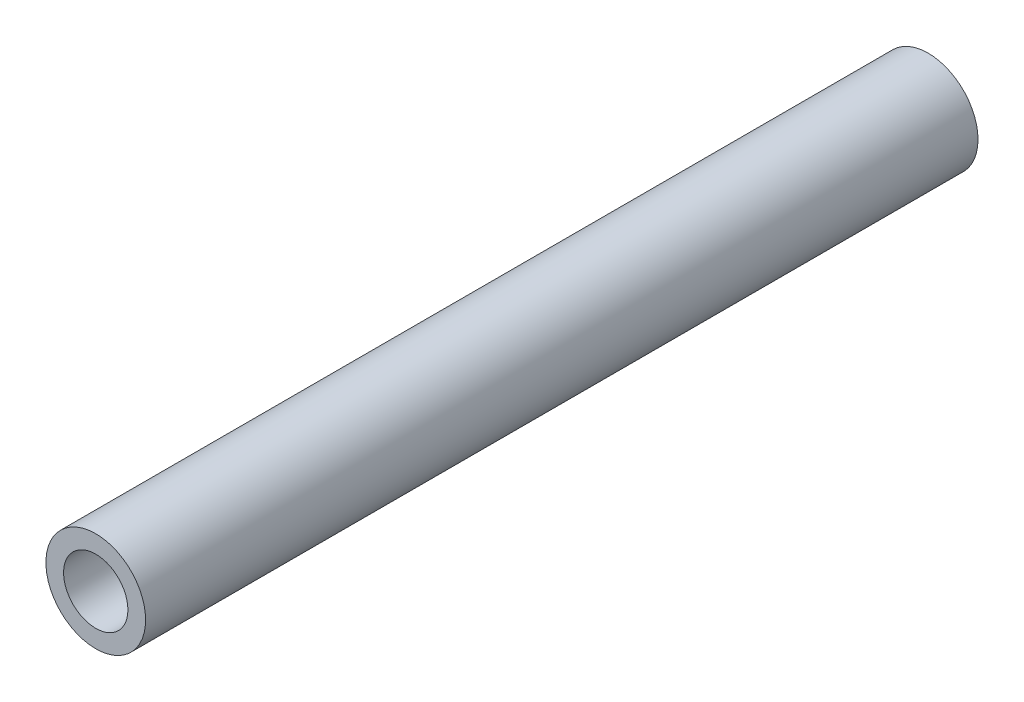
ISO-10303-21;
HEADER;
FILE_DESCRIPTION(('STEP AP214'),'2;1');
FILE_NAME('part.step','',(''),(''),'','','');
FILE_SCHEMA(('AUTOMOTIVE_DESIGN { 1 0 10303 214 1 1 1 1 }'));
ENDSEC;
DATA;
#1=APPLICATION_CONTEXT('core data for automotive mechanical design processes');
#2=APPLICATION_PROTOCOL_DEFINITION('international standard','automotive_design',2000,#1);
#3=PRODUCT_CONTEXT('',#1,'mechanical');
#4=PRODUCT('Part','Part','',(#3));
#5=PRODUCT_RELATED_PRODUCT_CATEGORY('part','',(#4));
#6=PRODUCT_DEFINITION_FORMATION('','',#4);
#7=PRODUCT_DEFINITION_CONTEXT('part definition',#1,'design');
#8=PRODUCT_DEFINITION('design','',#6,#7);
#9=PRODUCT_DEFINITION_SHAPE('','',#8);
#10=(LENGTH_UNIT() NAMED_UNIT(*) SI_UNIT(.MILLI.,.METRE.));
#11=(NAMED_UNIT(*) PLANE_ANGLE_UNIT() SI_UNIT($,.RADIAN.));
#12=(NAMED_UNIT(*) SI_UNIT($,.STERADIAN.) SOLID_ANGLE_UNIT());
#13=UNCERTAINTY_MEASURE_WITH_UNIT(LENGTH_MEASURE(1.E-05),#10,'distance_accuracy_value','');
#14=(GEOMETRIC_REPRESENTATION_CONTEXT(3) GLOBAL_UNCERTAINTY_ASSIGNED_CONTEXT((#13)) GLOBAL_UNIT_ASSIGNED_CONTEXT((#10,
#11,#12)) REPRESENTATION_CONTEXT('',''));
#15=CARTESIAN_POINT('',(0.,0.,0.));
#16=DIRECTION('',(0.,0.,1.));
#17=DIRECTION('',(1.,0.,0.));
#18=AXIS2_PLACEMENT_3D('',#15,#16,#17);
#19=CARTESIAN_POINT('',(0.,0.,66.802));
#20=DIRECTION('',(0.,0.,1.));
#21=DIRECTION('',(1.,0.,0.));
#22=AXIS2_PLACEMENT_3D('',#19,#20,#21);
#23=PLANE('',#22);
#24=CARTESIAN_POINT('',(0.,0.,66.802));
#25=DIRECTION('',(0.,0.,1.));
#26=DIRECTION('',(1.,0.,0.));
#27=AXIS2_PLACEMENT_3D('',#24,#25,#26);
#28=CIRCLE('',#27,4.);
#29=CARTESIAN_POINT('',(4.,0.,66.802));
#30=VERTEX_POINT('',#29);
#31=EDGE_CURVE('E10',#30,#30,#28,.T.);
#32=ORIENTED_EDGE('',*,*,#31,.T.);
#33=EDGE_LOOP('',(#32));
#34=FACE_BOUND('',#33,.T.);
#35=CARTESIAN_POINT('',(0.,0.,66.802));
#36=DIRECTION('',(0.,0.,1.));
#37=DIRECTION('',(1.,0.,0.));
#38=AXIS2_PLACEMENT_3D('',#35,#36,#37);
#39=CIRCLE('',#38,2.58037788044396);
#40=CARTESIAN_POINT('',(2.58037788044396,0.,66.802));
#41=VERTEX_POINT('',#40);
#42=EDGE_CURVE('E43',#41,#41,#39,.T.);
#43=ORIENTED_EDGE('',*,*,#42,.F.);
#44=EDGE_LOOP('',(#43));
#45=FACE_BOUND('',#44,.T.);
#46=ADVANCED_FACE('F32',(#34,#45),#23,.T.);
#47=CARTESIAN_POINT('',(0.,0.,0.));
#48=DIRECTION('',(0.,0.,1.));
#49=DIRECTION('',(1.,0.,0.));
#50=AXIS2_PLACEMENT_3D('',#47,#48,#49);
#51=PLANE('',#50);
#52=CARTESIAN_POINT('',(0.,0.,0.));
#53=DIRECTION('',(0.,0.,1.));
#54=DIRECTION('',(1.,0.,0.));
#55=AXIS2_PLACEMENT_3D('',#52,#53,#54);
#56=CIRCLE('',#55,4.);
#57=CARTESIAN_POINT('',(4.,0.,0.));
#58=VERTEX_POINT('',#57);
#59=EDGE_CURVE('E36',#58,#58,#56,.T.);
#60=ORIENTED_EDGE('',*,*,#59,.F.);
#61=EDGE_LOOP('',(#60));
#62=FACE_BOUND('',#61,.T.);
#63=CARTESIAN_POINT('',(0.,0.,0.));
#64=DIRECTION('',(0.,0.,1.));
#65=DIRECTION('',(1.,0.,0.));
#66=AXIS2_PLACEMENT_3D('',#63,#64,#65);
#67=CIRCLE('',#66,2.58037788044396);
#68=CARTESIAN_POINT('',(2.58037788044396,0.,0.));
#69=VERTEX_POINT('',#68);
#70=EDGE_CURVE('E45',#69,#69,#67,.T.);
#71=ORIENTED_EDGE('',*,*,#70,.T.);
#72=EDGE_LOOP('',(#71));
#73=FACE_BOUND('',#72,.T.);
#74=ADVANCED_FACE('F55',(#62,#73),#51,.F.);
#75=CARTESIAN_POINT('',(0.,0.,66.802));
#76=DIRECTION('',(0.,0.,-1.));
#77=DIRECTION('',(-1.,0.,0.));
#78=AXIS2_PLACEMENT_3D('',#75,#76,#77);
#79=CYLINDRICAL_SURFACE('',#78,4.);
#80=ORIENTED_EDGE('',*,*,#31,.F.);
#81=EDGE_LOOP('',(#80));
#82=FACE_BOUND('',#81,.T.);
#83=ORIENTED_EDGE('',*,*,#59,.T.);
#84=EDGE_LOOP('',(#83));
#85=FACE_BOUND('',#84,.T.);
#86=ADVANCED_FACE('F34',(#82,#85),#79,.T.);
#87=CARTESIAN_POINT('',(0.,0.,66.802));
#88=DIRECTION('',(0.,0.,-1.));
#89=DIRECTION('',(-1.,0.,0.));
#90=AXIS2_PLACEMENT_3D('',#87,#88,#89);
#91=CYLINDRICAL_SURFACE('',#90,2.58037788044396);
#92=ORIENTED_EDGE('',*,*,#42,.T.);
#93=EDGE_LOOP('',(#92));
#94=FACE_BOUND('',#93,.T.);
#95=ORIENTED_EDGE('',*,*,#70,.F.);
#96=EDGE_LOOP('',(#95));
#97=FACE_BOUND('',#96,.T.);
#98=ADVANCED_FACE('F51',(#94,#97),#91,.F.);
#99=CLOSED_SHELL('',(#46,#74,#86,#98));
#100=MANIFOLD_SOLID_BREP('B2',#99);
#101=ADVANCED_BREP_SHAPE_REPRESENTATION('',(#18,#100),#14);
#102=SHAPE_DEFINITION_REPRESENTATION(#9,#101);
ENDSEC;
END-ISO-10303-21;
